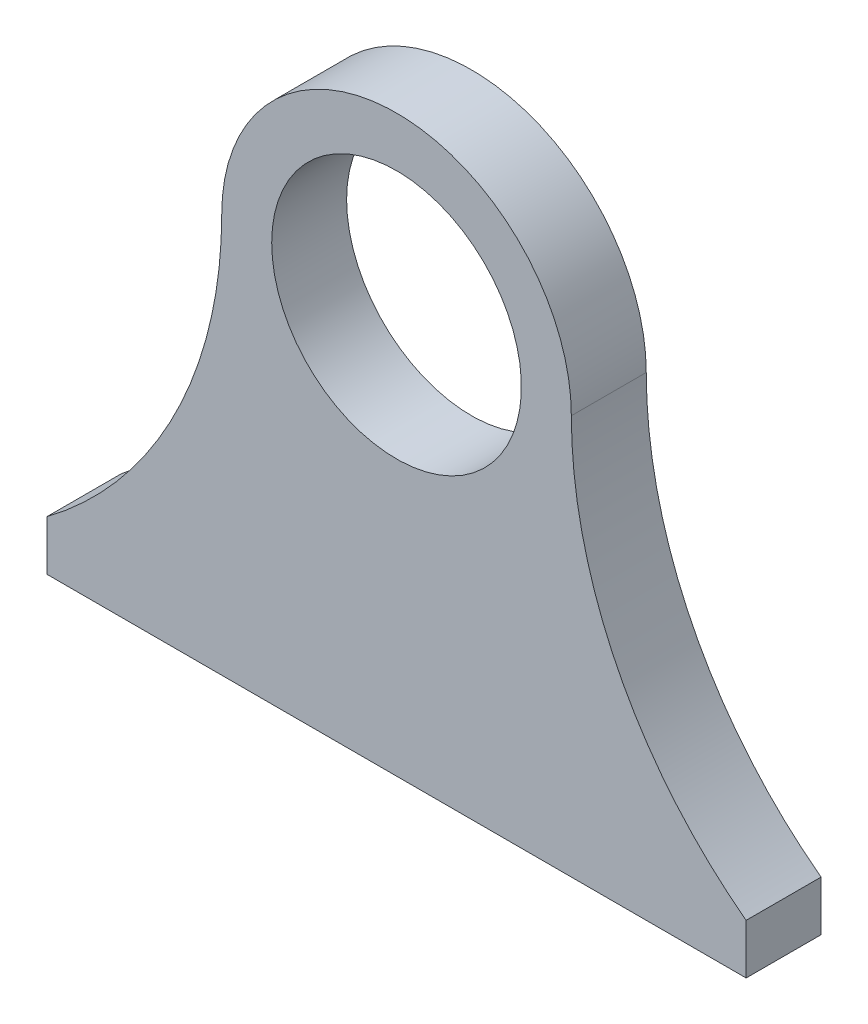
ISO-10303-21;
HEADER;
FILE_DESCRIPTION(('STEP AP214'),'2;1');
FILE_NAME('part.step','',(''),(''),'','','');
FILE_SCHEMA(('AUTOMOTIVE_DESIGN { 1 0 10303 214 1 1 1 1 }'));
ENDSEC;
DATA;
#1=APPLICATION_CONTEXT('core data for automotive mechanical design processes');
#2=APPLICATION_PROTOCOL_DEFINITION('international standard','automotive_design',2000,#1);
#3=PRODUCT_CONTEXT('',#1,'mechanical');
#4=PRODUCT('Part','Part','',(#3));
#5=PRODUCT_RELATED_PRODUCT_CATEGORY('part','',(#4));
#6=PRODUCT_DEFINITION_FORMATION('','',#4);
#7=PRODUCT_DEFINITION_CONTEXT('part definition',#1,'design');
#8=PRODUCT_DEFINITION('design','',#6,#7);
#9=PRODUCT_DEFINITION_SHAPE('','',#8);
#10=(LENGTH_UNIT() NAMED_UNIT(*) SI_UNIT(.MILLI.,.METRE.));
#11=(NAMED_UNIT(*) PLANE_ANGLE_UNIT() SI_UNIT($,.RADIAN.));
#12=(NAMED_UNIT(*) SI_UNIT($,.STERADIAN.) SOLID_ANGLE_UNIT());
#13=UNCERTAINTY_MEASURE_WITH_UNIT(LENGTH_MEASURE(1.E-05),#10,'distance_accuracy_value','');
#14=(GEOMETRIC_REPRESENTATION_CONTEXT(3) GLOBAL_UNCERTAINTY_ASSIGNED_CONTEXT((#13)) GLOBAL_UNIT_ASSIGNED_CONTEXT((#10,
#11,#12)) REPRESENTATION_CONTEXT('',''));
#15=CARTESIAN_POINT('',(0.,0.,0.));
#16=DIRECTION('',(0.,0.,1.));
#17=DIRECTION('',(1.,0.,0.));
#18=AXIS2_PLACEMENT_3D('',#15,#16,#17);
#19=CARTESIAN_POINT('',(38.89375,0.,4.7625));
#20=DIRECTION('',(0.,0.,-1.));
#21=DIRECTION('',(-1.,0.,0.));
#22=AXIS2_PLACEMENT_3D('',#19,#20,#21);
#23=CYLINDRICAL_SURFACE('',#22,27.78125);
#24=CARTESIAN_POINT('',(38.89375,0.,0.));
#25=DIRECTION('',(0.,0.,1.));
#26=DIRECTION('',(1.,0.,0.));
#27=AXIS2_PLACEMENT_3D('',#24,#25,#26);
#28=CIRCLE('',#27,27.78125);
#29=CARTESIAN_POINT('',(11.1125,0.,0.));
#30=VERTEX_POINT('',#29);
#31=CARTESIAN_POINT('',(22.225,-22.225,0.));
#32=VERTEX_POINT('',#31);
#33=EDGE_CURVE('E120',#30,#32,#28,.T.);
#34=ORIENTED_EDGE('',*,*,#33,.F.);
#35=DIRECTION('',(0.,0.,-1.));
#36=VECTOR('',#35,1.);
#37=CARTESIAN_POINT('',(11.1125,0.,4.7625));
#38=LINE('',#37,#36);
#39=CARTESIAN_POINT('',(11.1125,0.,4.7625));
#40=VERTEX_POINT('',#39);
#41=EDGE_CURVE('E11',#40,#30,#38,.T.);
#42=ORIENTED_EDGE('',*,*,#41,.F.);
#43=CARTESIAN_POINT('',(38.89375,0.,4.7625));
#44=DIRECTION('',(0.,0.,1.));
#45=DIRECTION('',(1.,0.,0.));
#46=AXIS2_PLACEMENT_3D('',#43,#44,#45);
#47=CIRCLE('',#46,27.78125);
#48=CARTESIAN_POINT('',(22.225,-22.225,4.7625));
#49=VERTEX_POINT('',#48);
#50=EDGE_CURVE('E135',#40,#49,#47,.T.);
#51=ORIENTED_EDGE('',*,*,#50,.T.);
#52=DIRECTION('',(0.,0.,-1.));
#53=VECTOR('',#52,1.);
#54=CARTESIAN_POINT('',(22.225,-22.225,4.7625));
#55=LINE('',#54,#53);
#56=EDGE_CURVE('E50',#49,#32,#55,.T.);
#57=ORIENTED_EDGE('',*,*,#56,.T.);
#58=EDGE_LOOP('',(#34,#42,#51,#57));
#59=FACE_BOUND('',#58,.T.);
#60=ADVANCED_FACE('F34',(#59),#23,.F.);
#61=CARTESIAN_POINT('',(0.,0.,4.7625));
#62=DIRECTION('',(0.,0.,-1.));
#63=DIRECTION('',(-1.,0.,0.));
#64=AXIS2_PLACEMENT_3D('',#61,#62,#63);
#65=CYLINDRICAL_SURFACE('',#64,11.1125);
#66=CARTESIAN_POINT('',(0.,0.,0.));
#67=DIRECTION('',(0.,0.,1.));
#68=DIRECTION('',(1.,0.,0.));
#69=AXIS2_PLACEMENT_3D('',#66,#67,#68);
#70=CIRCLE('',#69,11.1125);
#71=CARTESIAN_POINT('',(-11.1125,0.,0.));
#72=VERTEX_POINT('',#71);
#73=EDGE_CURVE('E122',#30,#72,#70,.T.);
#74=ORIENTED_EDGE('',*,*,#73,.T.);
#75=DIRECTION('',(0.,0.,-1.));
#76=VECTOR('',#75,1.);
#77=CARTESIAN_POINT('',(-11.1125,0.,4.7625));
#78=LINE('',#77,#76);
#79=CARTESIAN_POINT('',(-11.1125,0.,4.7625));
#80=VERTEX_POINT('',#79);
#81=EDGE_CURVE('E42',#80,#72,#78,.T.);
#82=ORIENTED_EDGE('',*,*,#81,.F.);
#83=CARTESIAN_POINT('',(0.,0.,4.7625));
#84=DIRECTION('',(0.,0.,1.));
#85=DIRECTION('',(1.,0.,0.));
#86=AXIS2_PLACEMENT_3D('',#83,#84,#85);
#87=CIRCLE('',#86,11.1125);
#88=EDGE_CURVE('E222',#40,#80,#87,.T.);
#89=ORIENTED_EDGE('',*,*,#88,.F.);
#90=ORIENTED_EDGE('',*,*,#41,.T.);
#91=EDGE_LOOP('',(#74,#82,#89,#90));
#92=FACE_BOUND('',#91,.T.);
#93=ADVANCED_FACE('F160',(#92),#65,.T.);
#94=CARTESIAN_POINT('',(-38.89375,0.,4.7625));
#95=DIRECTION('',(0.,0.,-1.));
#96=DIRECTION('',(-1.,0.,0.));
#97=AXIS2_PLACEMENT_3D('',#94,#95,#96);
#98=CYLINDRICAL_SURFACE('',#97,27.78125);
#99=CARTESIAN_POINT('',(-38.89375,0.,0.));
#100=DIRECTION('',(0.,0.,1.));
#101=DIRECTION('',(1.,0.,0.));
#102=AXIS2_PLACEMENT_3D('',#99,#100,#101);
#103=CIRCLE('',#102,27.78125);
#104=CARTESIAN_POINT('',(-22.225,-22.225,0.));
#105=VERTEX_POINT('',#104);
#106=EDGE_CURVE('E124',#72,#105,#103,.F.);
#107=ORIENTED_EDGE('',*,*,#106,.T.);
#108=DIRECTION('',(0.,0.,-1.));
#109=VECTOR('',#108,1.);
#110=CARTESIAN_POINT('',(-22.225,-22.225,4.7625));
#111=LINE('',#110,#109);
#112=CARTESIAN_POINT('',(-22.225,-22.225,4.7625));
#113=VERTEX_POINT('',#112);
#114=EDGE_CURVE('E109',#113,#105,#111,.T.);
#115=ORIENTED_EDGE('',*,*,#114,.F.);
#116=CARTESIAN_POINT('',(-38.89375,0.,4.7625));
#117=DIRECTION('',(0.,0.,1.));
#118=DIRECTION('',(1.,0.,0.));
#119=AXIS2_PLACEMENT_3D('',#116,#117,#118);
#120=CIRCLE('',#119,27.78125);
#121=EDGE_CURVE('E97',#80,#113,#120,.F.);
#122=ORIENTED_EDGE('',*,*,#121,.F.);
#123=ORIENTED_EDGE('',*,*,#81,.T.);
#124=EDGE_LOOP('',(#107,#115,#122,#123));
#125=FACE_BOUND('',#124,.T.);
#126=ADVANCED_FACE('F142',(#125),#98,.F.);
#127=CARTESIAN_POINT('',(-22.225,0.,4.7625));
#128=DIRECTION('',(1.,0.,0.));
#129=DIRECTION('',(0.,1.,0.));
#130=AXIS2_PLACEMENT_3D('',#127,#128,#129);
#131=PLANE('',#130);
#132=DIRECTION('',(0.,-1.,0.));
#133=VECTOR('',#132,1.);
#134=CARTESIAN_POINT('',(-22.225,0.,0.));
#135=LINE('',#134,#133);
#136=CARTESIAN_POINT('',(-22.225,-25.4,0.));
#137=VERTEX_POINT('',#136);
#138=EDGE_CURVE('E106',#105,#137,#135,.T.);
#139=ORIENTED_EDGE('',*,*,#138,.T.);
#140=DIRECTION('',(0.,0.,-1.));
#141=VECTOR('',#140,1.);
#142=CARTESIAN_POINT('',(-22.225,-25.4,4.7625));
#143=LINE('',#142,#141);
#144=CARTESIAN_POINT('',(-22.225,-25.4,4.7625));
#145=VERTEX_POINT('',#144);
#146=EDGE_CURVE('E103',#145,#137,#143,.T.);
#147=ORIENTED_EDGE('',*,*,#146,.F.);
#148=DIRECTION('',(0.,-1.,0.));
#149=VECTOR('',#148,1.);
#150=CARTESIAN_POINT('',(-22.225,0.,4.7625));
#151=LINE('',#150,#149);
#152=EDGE_CURVE('E88',#113,#145,#151,.T.);
#153=ORIENTED_EDGE('',*,*,#152,.F.);
#154=ORIENTED_EDGE('',*,*,#114,.T.);
#155=EDGE_LOOP('',(#139,#147,#153,#154));
#156=FACE_BOUND('',#155,.T.);
#157=ADVANCED_FACE('F104',(#156),#131,.F.);
#158=CARTESIAN_POINT('',(0.,-25.4,4.7625));
#159=DIRECTION('',(0.,1.,0.));
#160=DIRECTION('',(-1.,0.,0.));
#161=AXIS2_PLACEMENT_3D('',#158,#159,#160);
#162=PLANE('',#161);
#163=DIRECTION('',(1.,0.,0.));
#164=VECTOR('',#163,1.);
#165=CARTESIAN_POINT('',(0.,-25.4,0.));
#166=LINE('',#165,#164);
#167=CARTESIAN_POINT('',(22.225,-25.4,0.));
#168=VERTEX_POINT('',#167);
#169=EDGE_CURVE('E127',#137,#168,#166,.T.);
#170=ORIENTED_EDGE('',*,*,#169,.T.);
#171=DIRECTION('',(0.,0.,-1.));
#172=VECTOR('',#171,1.);
#173=CARTESIAN_POINT('',(22.225,-25.4,4.7625));
#174=LINE('',#173,#172);
#175=CARTESIAN_POINT('',(22.225,-25.4,4.7625));
#176=VERTEX_POINT('',#175);
#177=EDGE_CURVE('E70',#176,#168,#174,.T.);
#178=ORIENTED_EDGE('',*,*,#177,.F.);
#179=DIRECTION('',(1.,0.,0.));
#180=VECTOR('',#179,1.);
#181=CARTESIAN_POINT('',(0.,-25.4,4.7625));
#182=LINE('',#181,#180);
#183=EDGE_CURVE('E95',#145,#176,#182,.T.);
#184=ORIENTED_EDGE('',*,*,#183,.F.);
#185=ORIENTED_EDGE('',*,*,#146,.T.);
#186=EDGE_LOOP('',(#170,#178,#184,#185));
#187=FACE_BOUND('',#186,.T.);
#188=ADVANCED_FACE('F111',(#187),#162,.F.);
#189=CARTESIAN_POINT('',(22.225,0.,4.7625));
#190=DIRECTION('',(1.,0.,0.));
#191=DIRECTION('',(0.,0.,-1.));
#192=AXIS2_PLACEMENT_3D('',#189,#190,#191);
#193=PLANE('',#192);
#194=DIRECTION('',(0.,-1.,0.));
#195=VECTOR('',#194,1.);
#196=CARTESIAN_POINT('',(22.225,0.,0.));
#197=LINE('',#196,#195);
#198=EDGE_CURVE('E129',#32,#168,#197,.T.);
#199=ORIENTED_EDGE('',*,*,#198,.F.);
#200=ORIENTED_EDGE('',*,*,#56,.F.);
#201=DIRECTION('',(0.,-1.,0.));
#202=VECTOR('',#201,1.);
#203=CARTESIAN_POINT('',(22.225,0.,4.7625));
#204=LINE('',#203,#202);
#205=EDGE_CURVE('E112',#49,#176,#204,.T.);
#206=ORIENTED_EDGE('',*,*,#205,.T.);
#207=ORIENTED_EDGE('',*,*,#177,.T.);
#208=EDGE_LOOP('',(#199,#200,#206,#207));
#209=FACE_BOUND('',#208,.T.);
#210=ADVANCED_FACE('F148',(#209),#193,.T.);
#211=CARTESIAN_POINT('',(0.,0.,4.7625));
#212=DIRECTION('',(0.,0.,-1.));
#213=DIRECTION('',(-1.,0.,0.));
#214=AXIS2_PLACEMENT_3D('',#211,#212,#213);
#215=CYLINDRICAL_SURFACE('',#214,7.9375);
#216=CARTESIAN_POINT('',(0.,0.,4.7625));
#217=DIRECTION('',(0.,0.,1.));
#218=DIRECTION('',(1.,0.,0.));
#219=AXIS2_PLACEMENT_3D('',#216,#217,#218);
#220=CIRCLE('',#219,7.9375);
#221=CARTESIAN_POINT('',(-7.9375,0.,4.7625));
#222=VERTEX_POINT('',#221);
#223=EDGE_CURVE('E114',#222,#222,#220,.T.);
#224=CARTESIAN_POINT('',(0.,0.,0.));
#225=DIRECTION('',(0.,0.,1.));
#226=DIRECTION('',(1.,0.,0.));
#227=AXIS2_PLACEMENT_3D('',#224,#225,#226);
#228=CIRCLE('',#227,7.9375);
#229=CARTESIAN_POINT('',(-7.9375,0.,0.));
#230=VERTEX_POINT('',#229);
#231=EDGE_CURVE('E132',#230,#230,#228,.T.);
#232=CARTESIAN_POINT('',(-7.9375,0.,4.7625));
#233=CARTESIAN_POINT('',(-7.9375,0.,4.712890625));
#234=CARTESIAN_POINT('',(-7.9375,0.,4.66328125));
#235=CARTESIAN_POINT('',(-7.9375,0.,4.5640625));
#236=CARTESIAN_POINT('',(-7.9375,0.,4.514453125));
#237=CARTESIAN_POINT('',(-7.9375,0.,4.415234375));
#238=CARTESIAN_POINT('',(-7.9375,0.,4.365625));
#239=CARTESIAN_POINT('',(-7.9375,0.,4.26640625));
#240=CARTESIAN_POINT('',(-7.9375,0.,4.216796875));
#241=CARTESIAN_POINT('',(-7.9375,0.,4.117578125));
#242=CARTESIAN_POINT('',(-7.9375,0.,4.06796875));
#243=CARTESIAN_POINT('',(-7.9375,0.,3.96875));
#244=CARTESIAN_POINT('',(-7.9375,0.,3.919140625));
#245=CARTESIAN_POINT('',(-7.9375,0.,3.819921875));
#246=CARTESIAN_POINT('',(-7.9375,0.,3.7703125));
#247=CARTESIAN_POINT('',(-7.9375,0.,3.67109375));
#248=CARTESIAN_POINT('',(-7.9375,0.,3.621484375));
#249=CARTESIAN_POINT('',(-7.9375,0.,3.522265625));
#250=CARTESIAN_POINT('',(-7.9375,0.,3.47265625));
#251=CARTESIAN_POINT('',(-7.9375,0.,3.3734375));
#252=CARTESIAN_POINT('',(-7.9375,0.,3.323828125));
#253=CARTESIAN_POINT('',(-7.9375,0.,3.224609375));
#254=CARTESIAN_POINT('',(-7.9375,0.,3.175));
#255=CARTESIAN_POINT('',(-7.9375,0.,3.07578125));
#256=CARTESIAN_POINT('',(-7.9375,0.,3.026171875));
#257=CARTESIAN_POINT('',(-7.9375,0.,2.926953125));
#258=CARTESIAN_POINT('',(-7.9375,0.,2.87734375));
#259=CARTESIAN_POINT('',(-7.9375,0.,2.778125));
#260=CARTESIAN_POINT('',(-7.9375,0.,2.728515625));
#261=CARTESIAN_POINT('',(-7.9375,0.,2.629296875));
#262=CARTESIAN_POINT('',(-7.9375,0.,2.5796875));
#263=CARTESIAN_POINT('',(-7.9375,0.,2.48046875));
#264=CARTESIAN_POINT('',(-7.9375,0.,2.430859375));
#265=CARTESIAN_POINT('',(-7.9375,0.,2.331640625));
#266=CARTESIAN_POINT('',(-7.9375,0.,2.28203125));
#267=CARTESIAN_POINT('',(-7.9375,0.,2.1828125));
#268=CARTESIAN_POINT('',(-7.9375,0.,2.133203125));
#269=CARTESIAN_POINT('',(-7.9375,0.,2.033984375));
#270=CARTESIAN_POINT('',(-7.9375,0.,1.984375));
#271=CARTESIAN_POINT('',(-7.9375,0.,1.88515625));
#272=CARTESIAN_POINT('',(-7.9375,0.,1.835546875));
#273=CARTESIAN_POINT('',(-7.9375,0.,1.736328125));
#274=CARTESIAN_POINT('',(-7.9375,0.,1.68671875));
#275=CARTESIAN_POINT('',(-7.9375,0.,1.5875));
#276=CARTESIAN_POINT('',(-7.9375,0.,1.537890625));
#277=CARTESIAN_POINT('',(-7.9375,0.,1.438671875));
#278=CARTESIAN_POINT('',(-7.9375,0.,1.3890625));
#279=CARTESIAN_POINT('',(-7.9375,0.,1.28984375));
#280=CARTESIAN_POINT('',(-7.9375,0.,1.240234375));
#281=CARTESIAN_POINT('',(-7.9375,0.,1.141015625));
#282=CARTESIAN_POINT('',(-7.9375,0.,1.09140625));
#283=CARTESIAN_POINT('',(-7.9375,0.,0.9921875));
#284=CARTESIAN_POINT('',(-7.9375,0.,0.942578125));
#285=CARTESIAN_POINT('',(-7.9375,0.,0.843359375));
#286=CARTESIAN_POINT('',(-7.9375,0.,0.79375));
#287=CARTESIAN_POINT('',(-7.9375,0.,0.69453125));
#288=CARTESIAN_POINT('',(-7.9375,0.,0.644921875));
#289=CARTESIAN_POINT('',(-7.9375,0.,0.545703125));
#290=CARTESIAN_POINT('',(-7.9375,0.,0.49609375));
#291=CARTESIAN_POINT('',(-7.9375,0.,0.396875));
#292=CARTESIAN_POINT('',(-7.9375,0.,0.347265625));
#293=CARTESIAN_POINT('',(-7.9375,0.,0.248046875));
#294=CARTESIAN_POINT('',(-7.9375,0.,0.1984375));
#295=CARTESIAN_POINT('',(-7.9375,0.,0.09921875));
#296=CARTESIAN_POINT('',(-7.9375,0.,0.049609375));
#297=CARTESIAN_POINT('',(-7.9375,0.,0.));
#298=B_SPLINE_CURVE_WITH_KNOTS('',3,(#232,#233,#234,#235,#236,#237,#238,#239,#240,#241,#242,
#243,#244,#245,#246,#247,#248,#249,#250,#251,#252,#253,#254,#255,#256,#257,#258,#259,#260,#261,
#262,#263,#264,#265,#266,#267,#268,#269,#270,#271,#272,#273,#274,#275,#276,#277,#278,#279,#280,
#281,#282,#283,#284,#285,#286,#287,#288,#289,#290,#291,#292,#293,#294,#295,#296,#297),
.UNSPECIFIED.,.F.,.F.,(4,2,2,2,2,2,2,2,2,2,2,2,2,2,2,2,2,2,2,2,2,2,2,2,2,2,2,2,2,2,2,2,4),(0.,
0.148828124999999,0.297656249999999,0.446484374999999,0.595312499999999,0.744140625,0.89296875,
1.041796875,1.190625,1.339453125,1.48828125,1.637109375,1.7859375,1.934765625,2.08359375,
2.232421875,2.38125,2.530078125,2.67890625,2.827734375,2.9765625,3.125390625,3.27421875,
3.423046875,3.571875,3.720703125,3.86953125,4.018359375,4.1671875,4.316015625,4.46484375,
4.613671875,4.7625),.UNSPECIFIED.);
#299=EDGE_CURVE('BSEAM150',#222,#230,#298,.T.);
#300=ORIENTED_EDGE('',*,*,#223,.T.);
#301=ORIENTED_EDGE('',*,*,#231,.F.);
#302=ORIENTED_EDGE('',*,*,#299,.T.);
#303=ORIENTED_EDGE('',*,*,#299,.F.);
#304=EDGE_LOOP('',(#300,#302,#301,#303));
#305=FACE_BOUND('',#304,.T.);
#306=ADVANCED_FACE('F150',(#305),#215,.F.);
#307=CARTESIAN_POINT('',(0.,0.,4.7625));
#308=DIRECTION('',(0.,0.,1.));
#309=DIRECTION('',(1.,0.,0.));
#310=AXIS2_PLACEMENT_3D('',#307,#308,#309);
#311=PLANE('',#310);
#312=ORIENTED_EDGE('',*,*,#50,.F.);
#313=ORIENTED_EDGE('',*,*,#88,.T.);
#314=ORIENTED_EDGE('',*,*,#121,.T.);
#315=ORIENTED_EDGE('',*,*,#152,.T.);
#316=ORIENTED_EDGE('',*,*,#183,.T.);
#317=ORIENTED_EDGE('',*,*,#205,.F.);
#318=EDGE_LOOP('',(#312,#313,#314,#315,#316,#317));
#319=FACE_BOUND('',#318,.T.);
#320=ORIENTED_EDGE('',*,*,#223,.F.);
#321=EDGE_LOOP('',(#320));
#322=FACE_BOUND('',#321,.T.);
#323=ADVANCED_FACE('F91',(#319,#322),#311,.T.);
#324=CARTESIAN_POINT('',(0.,0.,0.));
#325=DIRECTION('',(0.,0.,1.));
#326=DIRECTION('',(1.,0.,0.));
#327=AXIS2_PLACEMENT_3D('',#324,#325,#326);
#328=PLANE('',#327);
#329=ORIENTED_EDGE('',*,*,#33,.T.);
#330=ORIENTED_EDGE('',*,*,#198,.T.);
#331=ORIENTED_EDGE('',*,*,#169,.F.);
#332=ORIENTED_EDGE('',*,*,#138,.F.);
#333=ORIENTED_EDGE('',*,*,#106,.F.);
#334=ORIENTED_EDGE('',*,*,#73,.F.);
#335=EDGE_LOOP('',(#329,#330,#331,#332,#333,#334));
#336=FACE_BOUND('',#335,.T.);
#337=ORIENTED_EDGE('',*,*,#231,.T.);
#338=EDGE_LOOP('',(#337));
#339=FACE_BOUND('',#338,.T.);
#340=ADVANCED_FACE('F146',(#336,#339),#328,.F.);
#341=CLOSED_SHELL('',(#60,#93,#126,#157,#188,#210,#306,#323,#340));
#342=MANIFOLD_SOLID_BREP('B2',#341);
#343=ADVANCED_BREP_SHAPE_REPRESENTATION('',(#18,#342),#14);
#344=SHAPE_DEFINITION_REPRESENTATION(#9,#343);
ENDSEC;
END-ISO-10303-21;
